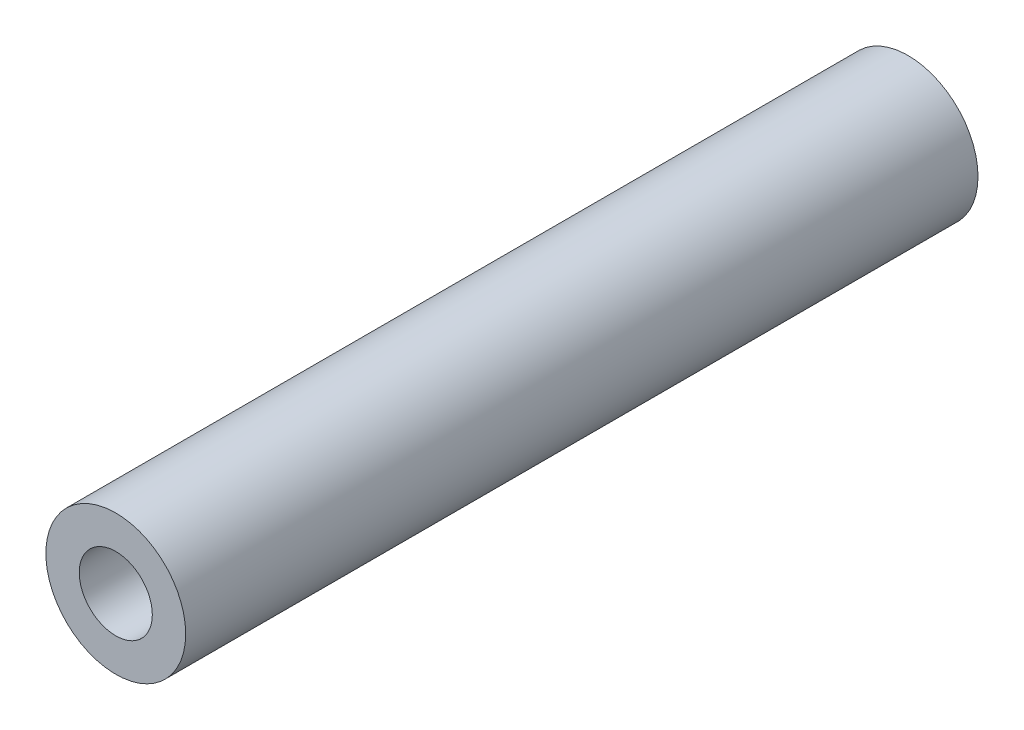
ISO-10303-21;
HEADER;
FILE_DESCRIPTION(('STEP AP214'),'2;1');
FILE_NAME('part.step','',(''),(''),'','','');
FILE_SCHEMA(('AUTOMOTIVE_DESIGN { 1 0 10303 214 1 1 1 1 }'));
ENDSEC;
DATA;
#1=APPLICATION_CONTEXT('core data for automotive mechanical design processes');
#2=APPLICATION_PROTOCOL_DEFINITION('international standard','automotive_design',2000,#1);
#3=PRODUCT_CONTEXT('',#1,'mechanical');
#4=PRODUCT('Part','Part','',(#3));
#5=PRODUCT_RELATED_PRODUCT_CATEGORY('part','',(#4));
#6=PRODUCT_DEFINITION_FORMATION('','',#4);
#7=PRODUCT_DEFINITION_CONTEXT('part definition',#1,'design');
#8=PRODUCT_DEFINITION('design','',#6,#7);
#9=PRODUCT_DEFINITION_SHAPE('','',#8);
#10=(LENGTH_UNIT() NAMED_UNIT(*) SI_UNIT(.MILLI.,.METRE.));
#11=(NAMED_UNIT(*) PLANE_ANGLE_UNIT() SI_UNIT($,.RADIAN.));
#12=(NAMED_UNIT(*) SI_UNIT($,.STERADIAN.) SOLID_ANGLE_UNIT());
#13=UNCERTAINTY_MEASURE_WITH_UNIT(LENGTH_MEASURE(1.E-05),#10,'distance_accuracy_value','');
#14=(GEOMETRIC_REPRESENTATION_CONTEXT(3) GLOBAL_UNCERTAINTY_ASSIGNED_CONTEXT((#13)) GLOBAL_UNIT_ASSIGNED_CONTEXT((#10,
#11,#12)) REPRESENTATION_CONTEXT('',''));
#15=CARTESIAN_POINT('',(0.,0.,0.));
#16=DIRECTION('',(0.,0.,1.));
#17=DIRECTION('',(1.,0.,0.));
#18=AXIS2_PLACEMENT_3D('',#15,#16,#17);
#19=CARTESIAN_POINT('',(0.,0.,53.975));
#20=DIRECTION('',(0.,0.,1.));
#21=DIRECTION('',(1.,0.,0.));
#22=AXIS2_PLACEMENT_3D('',#19,#20,#21);
#23=PLANE('',#22);
#24=CARTESIAN_POINT('',(0.,0.,53.975));
#25=DIRECTION('',(0.,0.,1.));
#26=DIRECTION('',(1.,0.,0.));
#27=AXIS2_PLACEMENT_3D('',#24,#25,#26);
#28=CIRCLE('',#27,4.7625);
#29=CARTESIAN_POINT('',(4.7625,0.,53.975));
#30=VERTEX_POINT('',#29);
#31=EDGE_CURVE('E10',#30,#30,#28,.T.);
#32=ORIENTED_EDGE('',*,*,#31,.T.);
#33=EDGE_LOOP('',(#32));
#34=FACE_BOUND('',#33,.T.);
#35=CARTESIAN_POINT('',(0.,0.,53.975));
#36=DIRECTION('',(0.,0.,1.));
#37=DIRECTION('',(1.,0.,0.));
#38=AXIS2_PLACEMENT_3D('',#35,#36,#37);
#39=CIRCLE('',#38,2.4892);
#40=CARTESIAN_POINT('',(2.4892,0.,53.975));
#41=VERTEX_POINT('',#40);
#42=EDGE_CURVE('E56',#41,#41,#39,.T.);
#43=ORIENTED_EDGE('',*,*,#42,.F.);
#44=EDGE_LOOP('',(#43));
#45=FACE_BOUND('',#44,.T.);
#46=ADVANCED_FACE('F43',(#34,#45),#23,.T.);
#47=CARTESIAN_POINT('',(0.,0.,0.));
#48=DIRECTION('',(0.,0.,1.));
#49=DIRECTION('',(1.,0.,0.));
#50=AXIS2_PLACEMENT_3D('',#47,#48,#49);
#51=PLANE('',#50);
#52=CARTESIAN_POINT('',(0.,0.,0.));
#53=DIRECTION('',(0.,0.,1.));
#54=DIRECTION('',(1.,0.,0.));
#55=AXIS2_PLACEMENT_3D('',#52,#53,#54);
#56=CIRCLE('',#55,4.7625);
#57=CARTESIAN_POINT('',(4.7625,0.,0.));
#58=VERTEX_POINT('',#57);
#59=EDGE_CURVE('E47',#58,#58,#56,.T.);
#60=ORIENTED_EDGE('',*,*,#59,.F.);
#61=EDGE_LOOP('',(#60));
#62=FACE_BOUND('',#61,.T.);
#63=CARTESIAN_POINT('',(0.,0.,0.));
#64=DIRECTION('',(0.,0.,1.));
#65=DIRECTION('',(1.,0.,0.));
#66=AXIS2_PLACEMENT_3D('',#63,#64,#65);
#67=CIRCLE('',#66,2.4892);
#68=CARTESIAN_POINT('',(2.4892,0.,0.));
#69=VERTEX_POINT('',#68);
#70=EDGE_CURVE('E58',#69,#69,#67,.T.);
#71=ORIENTED_EDGE('',*,*,#70,.T.);
#72=EDGE_LOOP('',(#71));
#73=FACE_BOUND('',#72,.T.);
#74=ADVANCED_FACE('F70',(#62,#73),#51,.F.);
#75=CARTESIAN_POINT('',(0.,0.,53.975));
#76=DIRECTION('',(0.,0.,-1.));
#77=DIRECTION('',(-1.,0.,0.));
#78=AXIS2_PLACEMENT_3D('',#75,#76,#77);
#79=CYLINDRICAL_SURFACE('',#78,4.7625);
#80=ORIENTED_EDGE('',*,*,#31,.F.);
#81=EDGE_LOOP('',(#80));
#82=FACE_BOUND('',#81,.T.);
#83=ORIENTED_EDGE('',*,*,#59,.T.);
#84=EDGE_LOOP('',(#83));
#85=FACE_BOUND('',#84,.T.);
#86=ADVANCED_FACE('F45',(#82,#85),#79,.T.);
#87=CARTESIAN_POINT('',(0.,0.,53.975));
#88=DIRECTION('',(0.,0.,-1.));
#89=DIRECTION('',(-1.,0.,0.));
#90=AXIS2_PLACEMENT_3D('',#87,#88,#89);
#91=CYLINDRICAL_SURFACE('',#90,2.4892);
#92=ORIENTED_EDGE('',*,*,#42,.T.);
#93=EDGE_LOOP('',(#92));
#94=FACE_BOUND('',#93,.T.);
#95=ORIENTED_EDGE('',*,*,#70,.F.);
#96=EDGE_LOOP('',(#95));
#97=FACE_BOUND('',#96,.T.);
#98=ADVANCED_FACE('F66',(#94,#97),#91,.F.);
#99=CLOSED_SHELL('',(#46,#74,#86,#98));
#100=MANIFOLD_SOLID_BREP('B2',#99);
#101=ADVANCED_BREP_SHAPE_REPRESENTATION('',(#18,#100),#14);
#102=SHAPE_DEFINITION_REPRESENTATION(#9,#101);
ENDSEC;
END-ISO-10303-21;
